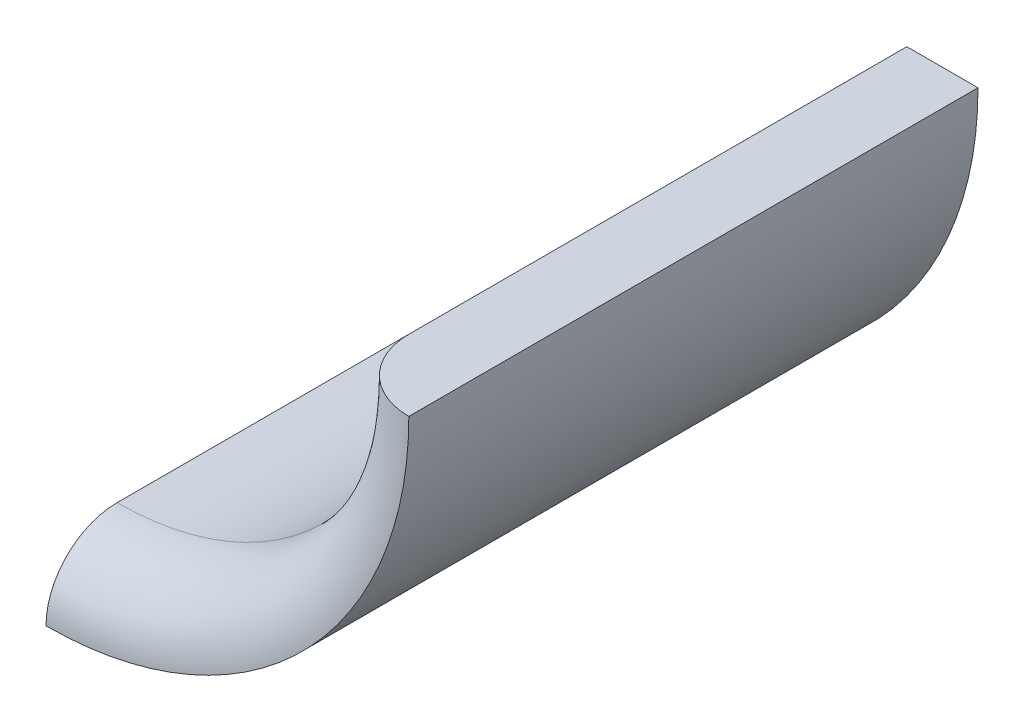
ISO-10303-21;
HEADER;
FILE_DESCRIPTION(('STEP AP214'),'2;1');
FILE_NAME('part.step','',(''),(''),'','','');
FILE_SCHEMA(('AUTOMOTIVE_DESIGN { 1 0 10303 214 1 1 1 1 }'));
ENDSEC;
DATA;
#1=APPLICATION_CONTEXT('core data for automotive mechanical design processes');
#2=APPLICATION_PROTOCOL_DEFINITION('international standard','automotive_design',2000,#1);
#3=PRODUCT_CONTEXT('',#1,'mechanical');
#4=PRODUCT('Part','Part','',(#3));
#5=PRODUCT_RELATED_PRODUCT_CATEGORY('part','',(#4));
#6=PRODUCT_DEFINITION_FORMATION('','',#4);
#7=PRODUCT_DEFINITION_CONTEXT('part definition',#1,'design');
#8=PRODUCT_DEFINITION('design','',#6,#7);
#9=PRODUCT_DEFINITION_SHAPE('','',#8);
#10=(LENGTH_UNIT() NAMED_UNIT(*) SI_UNIT(.MILLI.,.METRE.));
#11=(NAMED_UNIT(*) PLANE_ANGLE_UNIT() SI_UNIT($,.RADIAN.));
#12=(NAMED_UNIT(*) SI_UNIT($,.STERADIAN.) SOLID_ANGLE_UNIT());
#13=UNCERTAINTY_MEASURE_WITH_UNIT(LENGTH_MEASURE(1.E-05),#10,'distance_accuracy_value','');
#14=(GEOMETRIC_REPRESENTATION_CONTEXT(3) GLOBAL_UNCERTAINTY_ASSIGNED_CONTEXT((#13)) GLOBAL_UNIT_ASSIGNED_CONTEXT((#10,
#11,#12)) REPRESENTATION_CONTEXT('',''));
#15=CARTESIAN_POINT('',(0.,0.,0.));
#16=DIRECTION('',(0.,0.,1.));
#17=DIRECTION('',(1.,0.,0.));
#18=AXIS2_PLACEMENT_3D('',#15,#16,#17);
#19=CARTESIAN_POINT('',(0.,0.,0.));
#20=DIRECTION('',(0.,0.,1.));
#21=DIRECTION('',(1.,0.,0.));
#22=AXIS2_PLACEMENT_3D('',#19,#20,#21);
#23=PLANE('',#22);
#24=DIRECTION('',(1.,0.,0.));
#25=VECTOR('',#24,1.);
#26=CARTESIAN_POINT('',(0.,0.,0.));
#27=LINE('',#26,#25);
#28=CARTESIAN_POINT('',(410.,0.,0.));
#29=VERTEX_POINT('',#28);
#30=CARTESIAN_POINT('',(510.,0.,0.));
#31=VERTEX_POINT('',#30);
#32=EDGE_CURVE('E104',#29,#31,#27,.T.);
#33=ORIENTED_EDGE('',*,*,#32,.T.);
#34=CARTESIAN_POINT('',(0.,0.,0.));
#35=DIRECTION('',(0.,0.,1.));
#36=DIRECTION('',(1.,0.,0.));
#37=AXIS2_PLACEMENT_3D('',#34,#35,#36);
#38=CIRCLE('',#37,510.);
#39=CARTESIAN_POINT('',(0.,-510.,0.));
#40=VERTEX_POINT('',#39);
#41=EDGE_CURVE('E86',#40,#31,#38,.T.);
#42=ORIENTED_EDGE('',*,*,#41,.F.);
#43=DIRECTION('',(0.,1.,0.));
#44=VECTOR('',#43,1.);
#45=CARTESIAN_POINT('',(0.,0.,0.));
#46=LINE('',#45,#44);
#47=CARTESIAN_POINT('',(0.,-410.,0.));
#48=VERTEX_POINT('',#47);
#49=EDGE_CURVE('E101',#40,#48,#46,.T.);
#50=ORIENTED_EDGE('',*,*,#49,.T.);
#51=CARTESIAN_POINT('',(0.,0.,0.));
#52=DIRECTION('',(0.,0.,1.));
#53=DIRECTION('',(1.,0.,0.));
#54=AXIS2_PLACEMENT_3D('',#51,#52,#53);
#55=CIRCLE('',#54,410.);
#56=EDGE_CURVE('E87',#48,#29,#55,.T.);
#57=ORIENTED_EDGE('',*,*,#56,.T.);
#58=EDGE_LOOP('',(#33,#42,#50,#57));
#59=FACE_BOUND('',#58,.T.);
#60=ADVANCED_FACE('F35',(#59),#23,.F.);
#61=CARTESIAN_POINT('',(0.,0.,800.));
#62=DIRECTION('',(0.,0.,-1.));
#63=DIRECTION('',(-1.,0.,0.));
#64=AXIS2_PLACEMENT_3D('',#61,#62,#63);
#65=CYLINDRICAL_SURFACE('',#64,510.);
#66=DIRECTION('',(0.,0.,-1.));
#67=VECTOR('',#66,1.);
#68=CARTESIAN_POINT('',(510.,0.,800.));
#69=LINE('',#68,#67);
#70=CARTESIAN_POINT('',(510.,0.,800.));
#71=VERTEX_POINT('',#70);
#72=EDGE_CURVE('E74',#71,#31,#69,.T.);
#73=ORIENTED_EDGE('',*,*,#72,.F.);
#74=CARTESIAN_POINT('',(0.,0.,800.));
#75=DIRECTION('',(0.,0.,1.));
#76=DIRECTION('',(1.,0.,0.));
#77=AXIS2_PLACEMENT_3D('',#74,#75,#76);
#78=CIRCLE('',#77,510.);
#79=CARTESIAN_POINT('',(0.,-510.,800.));
#80=VERTEX_POINT('',#79);
#81=EDGE_CURVE('E84',#80,#71,#78,.T.);
#82=ORIENTED_EDGE('',*,*,#81,.F.);
#83=DIRECTION('',(0.,0.,-1.));
#84=VECTOR('',#83,1.);
#85=CARTESIAN_POINT('',(0.,-510.,800.));
#86=LINE('',#85,#84);
#87=EDGE_CURVE('E57',#40,#80,#86,.F.);
#88=ORIENTED_EDGE('',*,*,#87,.F.);
#89=ORIENTED_EDGE('',*,*,#41,.T.);
#90=EDGE_LOOP('',(#73,#82,#88,#89));
#91=FACE_BOUND('',#90,.T.);
#92=ADVANCED_FACE('F83',(#91),#65,.T.);
#93=CARTESIAN_POINT('',(0.,0.,800.));
#94=DIRECTION('',(0.,0.,-1.));
#95=DIRECTION('',(-1.,0.,0.));
#96=AXIS2_PLACEMENT_3D('',#93,#94,#95);
#97=CYLINDRICAL_SURFACE('',#96,410.);
#98=CARTESIAN_POINT('',(0.,0.,700.));
#99=DIRECTION('',(0.,0.,1.));
#100=DIRECTION('',(1.,0.,0.));
#101=AXIS2_PLACEMENT_3D('',#98,#99,#100);
#102=CIRCLE('',#101,410.);
#103=CARTESIAN_POINT('',(0.,-410.,700.));
#104=VERTEX_POINT('',#103);
#105=CARTESIAN_POINT('',(410.,0.,700.));
#106=VERTEX_POINT('',#105);
#107=EDGE_CURVE('E89',#104,#106,#102,.T.);
#108=ORIENTED_EDGE('',*,*,#107,.T.);
#109=DIRECTION('',(0.,0.,-1.));
#110=VECTOR('',#109,1.);
#111=CARTESIAN_POINT('',(410.,0.,800.));
#112=LINE('',#111,#110);
#113=EDGE_CURVE('E50',#106,#29,#112,.T.);
#114=ORIENTED_EDGE('',*,*,#113,.T.);
#115=ORIENTED_EDGE('',*,*,#56,.F.);
#116=DIRECTION('',(0.,0.,-1.));
#117=VECTOR('',#116,1.);
#118=CARTESIAN_POINT('',(0.,-410.,800.));
#119=LINE('',#118,#117);
#120=EDGE_CURVE('E98',#48,#104,#119,.F.);
#121=ORIENTED_EDGE('',*,*,#120,.T.);
#122=EDGE_LOOP('',(#108,#114,#115,#121));
#123=FACE_BOUND('',#122,.T.);
#124=ADVANCED_FACE('F108',(#123),#97,.F.);
#125=CARTESIAN_POINT('',(0.,0.,700.));
#126=DIRECTION('',(0.,0.,1.));
#127=DIRECTION('',(1.,0.,0.));
#128=AXIS2_PLACEMENT_3D('',#125,#126,#127);
#129=TOROIDAL_SURFACE('',#128,510.,100.);
#130=ORIENTED_EDGE('',*,*,#81,.T.);
#131=CARTESIAN_POINT('',(510.,0.,700.));
#132=DIRECTION('',(0.,1.,0.));
#133=DIRECTION('',(0.,0.,1.));
#134=AXIS2_PLACEMENT_3D('',#131,#132,#133);
#135=CIRCLE('',#134,100.);
#136=EDGE_CURVE('E11',#71,#106,#135,.F.);
#137=ORIENTED_EDGE('',*,*,#136,.T.);
#138=ORIENTED_EDGE('',*,*,#107,.F.);
#139=CARTESIAN_POINT('',(0.,-510.,700.));
#140=DIRECTION('',(-1.,0.,0.));
#141=DIRECTION('',(0.,0.,1.));
#142=AXIS2_PLACEMENT_3D('',#139,#140,#141);
#143=CIRCLE('',#142,100.);
#144=EDGE_CURVE('E43',#104,#80,#143,.F.);
#145=ORIENTED_EDGE('',*,*,#144,.T.);
#146=EDGE_LOOP('',(#130,#137,#138,#145));
#147=FACE_BOUND('',#146,.T.);
#148=ADVANCED_FACE('F37',(#147),#129,.T.);
#149=CARTESIAN_POINT('',(0.,0.,800.));
#150=DIRECTION('',(-1.,0.,0.));
#151=DIRECTION('',(0.,0.,1.));
#152=AXIS2_PLACEMENT_3D('',#149,#150,#151);
#153=PLANE('',#152);
#154=ORIENTED_EDGE('',*,*,#87,.T.);
#155=ORIENTED_EDGE('',*,*,#144,.F.);
#156=ORIENTED_EDGE('',*,*,#120,.F.);
#157=ORIENTED_EDGE('',*,*,#49,.F.);
#158=EDGE_LOOP('',(#154,#155,#156,#157));
#159=FACE_BOUND('',#158,.T.);
#160=ADVANCED_FACE('F109',(#159),#153,.T.);
#161=CARTESIAN_POINT('',(0.,0.,800.));
#162=DIRECTION('',(0.,1.,0.));
#163=DIRECTION('',(0.,0.,1.));
#164=AXIS2_PLACEMENT_3D('',#161,#162,#163);
#165=PLANE('',#164);
#166=ORIENTED_EDGE('',*,*,#72,.T.);
#167=ORIENTED_EDGE('',*,*,#32,.F.);
#168=ORIENTED_EDGE('',*,*,#113,.F.);
#169=ORIENTED_EDGE('',*,*,#136,.F.);
#170=EDGE_LOOP('',(#166,#167,#168,#169));
#171=FACE_BOUND('',#170,.T.);
#172=ADVANCED_FACE('F73',(#171),#165,.T.);
#173=CLOSED_SHELL('',(#60,#92,#124,#148,#160,#172));
#174=MANIFOLD_SOLID_BREP('B2',#173);
#175=ADVANCED_BREP_SHAPE_REPRESENTATION('',(#18,#174),#14);
#176=SHAPE_DEFINITION_REPRESENTATION(#9,#175);
ENDSEC;
END-ISO-10303-21;
